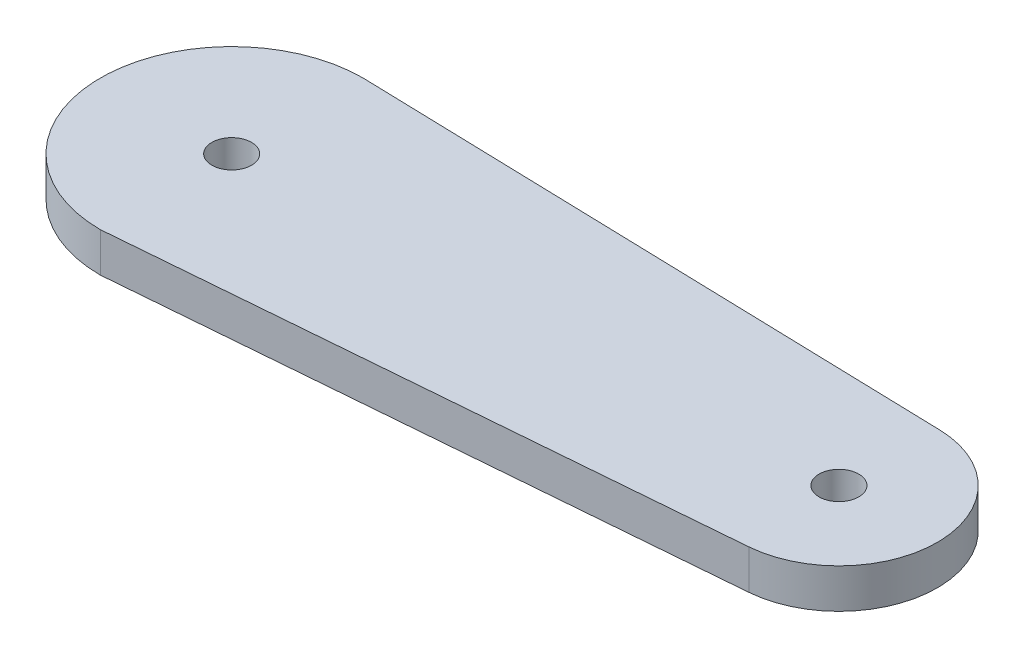
ISO-10303-21;
HEADER;
FILE_DESCRIPTION(('STEP AP214'),'2;1');
FILE_NAME('part.step','',(''),(''),'','','');
FILE_SCHEMA(('AUTOMOTIVE_DESIGN { 1 0 10303 214 1 1 1 1 }'));
ENDSEC;
DATA;
#1=APPLICATION_CONTEXT('core data for automotive mechanical design processes');
#2=APPLICATION_PROTOCOL_DEFINITION('international standard','automotive_design',2000,#1);
#3=PRODUCT_CONTEXT('',#1,'mechanical');
#4=PRODUCT('Part','Part','',(#3));
#5=PRODUCT_RELATED_PRODUCT_CATEGORY('part','',(#4));
#6=PRODUCT_DEFINITION_FORMATION('','',#4);
#7=PRODUCT_DEFINITION_CONTEXT('part definition',#1,'design');
#8=PRODUCT_DEFINITION('design','',#6,#7);
#9=PRODUCT_DEFINITION_SHAPE('','',#8);
#10=(LENGTH_UNIT() NAMED_UNIT(*) SI_UNIT(.MILLI.,.METRE.));
#11=(NAMED_UNIT(*) PLANE_ANGLE_UNIT() SI_UNIT($,.RADIAN.));
#12=(NAMED_UNIT(*) SI_UNIT($,.STERADIAN.) SOLID_ANGLE_UNIT());
#13=UNCERTAINTY_MEASURE_WITH_UNIT(LENGTH_MEASURE(1.E-05),#10,'distance_accuracy_value','');
#14=(GEOMETRIC_REPRESENTATION_CONTEXT(3) GLOBAL_UNCERTAINTY_ASSIGNED_CONTEXT((#13)) GLOBAL_UNIT_ASSIGNED_CONTEXT((#10,
#11,#12)) REPRESENTATION_CONTEXT('',''));
#15=CARTESIAN_POINT('',(0.,0.,0.));
#16=DIRECTION('',(0.,0.,1.));
#17=DIRECTION('',(1.,0.,0.));
#18=AXIS2_PLACEMENT_3D('',#15,#16,#17);
#19=CARTESIAN_POINT('',(0.821566681352623,3.,9.93204097591365));
#20=DIRECTION('',(-0.0824372634712927,0.,-0.996596256059275));
#21=DIRECTION('',(-0.996596256059275,0.,0.0824372634712927));
#22=AXIS2_PLACEMENT_3D('',#19,#20,#21);
#23=PLANE('',#22);
#24=DIRECTION('',(0.996596256059275,0.,-0.0824372634712927));
#25=VECTOR('',#24,1.);
#26=CARTESIAN_POINT('',(0.821566681352623,0.,9.93204097591365));
#27=LINE('',#26,#25);
#28=CARTESIAN_POINT('',(0.,0.,10.));
#29=VERTEX_POINT('',#28);
#30=CARTESIAN_POINT('',(45.6010112062696,0.,6.22793829245028));
#31=VERTEX_POINT('',#30);
#32=EDGE_CURVE('E97',#29,#31,#27,.T.);
#33=ORIENTED_EDGE('',*,*,#32,.T.);
#34=DIRECTION('',(0.,-1.,0.));
#35=VECTOR('',#34,1.);
#36=CARTESIAN_POINT('',(45.6010112062696,3.,6.22793829245028));
#37=LINE('',#36,#35);
#38=CARTESIAN_POINT('',(45.6010112062696,3.,6.22793829245028));
#39=VERTEX_POINT('',#38);
#40=EDGE_CURVE('E11',#39,#31,#37,.T.);
#41=ORIENTED_EDGE('',*,*,#40,.F.);
#42=DIRECTION('',(0.996596256059275,0.,-0.0824372634712927));
#43=VECTOR('',#42,1.);
#44=CARTESIAN_POINT('',(0.821566681352623,3.,9.93204097591365));
#45=LINE('',#44,#43);
#46=CARTESIAN_POINT('',(0.,3.,10.));
#47=VERTEX_POINT('',#46);
#48=EDGE_CURVE('E82',#47,#39,#45,.T.);
#49=ORIENTED_EDGE('',*,*,#48,.F.);
#50=DIRECTION('',(0.,-1.,0.));
#51=VECTOR('',#50,1.);
#52=CARTESIAN_POINT('',(0.,3.,10.));
#53=LINE('',#52,#51);
#54=EDGE_CURVE('E93',#47,#29,#53,.T.);
#55=ORIENTED_EDGE('',*,*,#54,.T.);
#56=EDGE_LOOP('',(#33,#41,#49,#55));
#57=FACE_BOUND('',#56,.T.);
#58=ADVANCED_FACE('F35',(#57),#23,.F.);
#59=CARTESIAN_POINT('',(44.9827317302349,3.,-1.24653362799429));
#60=DIRECTION('',(0.,-1.,0.));
#61=DIRECTION('',(0.,0.,-1.));
#62=AXIS2_PLACEMENT_3D('',#59,#60,#61);
#63=CYLINDRICAL_SURFACE('',#62,7.50000000000001);
#64=CARTESIAN_POINT('',(44.9827317302349,0.,-1.24653362799429));
#65=DIRECTION('',(0.,1.,0.));
#66=DIRECTION('',(0.,0.,1.));
#67=AXIS2_PLACEMENT_3D('',#64,#65,#66);
#68=CIRCLE('',#67,7.50000000000001);
#69=CARTESIAN_POINT('',(45.1911593044558,0.,-8.74363693169128));
#70=VERTEX_POINT('',#69);
#71=EDGE_CURVE('E87',#31,#70,#68,.T.);
#72=ORIENTED_EDGE('',*,*,#71,.T.);
#73=DIRECTION('',(0.,-1.,0.));
#74=VECTOR('',#73,1.);
#75=CARTESIAN_POINT('',(45.1911593044558,3.,-8.74363693169128));
#76=LINE('',#75,#74);
#77=CARTESIAN_POINT('',(45.1911593044558,3.,-8.74363693169128));
#78=VERTEX_POINT('',#77);
#79=EDGE_CURVE('E43',#78,#70,#76,.T.);
#80=ORIENTED_EDGE('',*,*,#79,.F.);
#81=CARTESIAN_POINT('',(44.9827317302349,3.,-1.24653362799429));
#82=DIRECTION('',(0.,1.,0.));
#83=DIRECTION('',(0.,0.,1.));
#84=AXIS2_PLACEMENT_3D('',#81,#82,#83);
#85=CIRCLE('',#84,7.50000000000001);
#86=EDGE_CURVE('E77',#39,#78,#85,.T.);
#87=ORIENTED_EDGE('',*,*,#86,.F.);
#88=ORIENTED_EDGE('',*,*,#40,.T.);
#89=EDGE_LOOP('',(#72,#80,#87,#88));
#90=FACE_BOUND('',#89,.T.);
#91=ADVANCED_FACE('F86',(#90),#63,.T.);
#92=CARTESIAN_POINT('',(0.277796098715276,3.,-9.99227696823189));
#93=DIRECTION('',(0.0277903432294599,0.,-0.999613773826266));
#94=DIRECTION('',(-0.999613773826266,0.,-0.0277903432294599));
#95=AXIS2_PLACEMENT_3D('',#92,#93,#94);
#96=PLANE('',#95);
#97=DIRECTION('',(0.999613773826266,0.,0.0277903432294599));
#98=VECTOR('',#97,1.);
#99=CARTESIAN_POINT('',(0.277796098715276,0.,-9.99227696823189));
#100=LINE('',#99,#98);
#101=CARTESIAN_POINT('',(0.,0.,-10.));
#102=VERTEX_POINT('',#101);
#103=EDGE_CURVE('E102',#102,#70,#100,.T.);
#104=ORIENTED_EDGE('',*,*,#103,.F.);
#105=DIRECTION('',(0.,-1.,0.));
#106=VECTOR('',#105,1.);
#107=CARTESIAN_POINT('',(0.,3.,-10.));
#108=LINE('',#107,#106);
#109=CARTESIAN_POINT('',(0.,3.,-10.));
#110=VERTEX_POINT('',#109);
#111=EDGE_CURVE('E67',#110,#102,#108,.T.);
#112=ORIENTED_EDGE('',*,*,#111,.F.);
#113=DIRECTION('',(0.999613773826266,0.,0.0277903432294599));
#114=VECTOR('',#113,1.);
#115=CARTESIAN_POINT('',(0.277796098715276,3.,-9.99227696823189));
#116=LINE('',#115,#114);
#117=EDGE_CURVE('E80',#110,#78,#116,.T.);
#118=ORIENTED_EDGE('',*,*,#117,.T.);
#119=ORIENTED_EDGE('',*,*,#79,.T.);
#120=EDGE_LOOP('',(#104,#112,#118,#119));
#121=FACE_BOUND('',#120,.T.);
#122=ADVANCED_FACE('F91',(#121),#96,.T.);
#123=CARTESIAN_POINT('',(0.,3.,0.));
#124=DIRECTION('',(0.,-1.,0.));
#125=DIRECTION('',(0.,0.,-1.));
#126=AXIS2_PLACEMENT_3D('',#123,#124,#125);
#127=CYLINDRICAL_SURFACE('',#126,10.);
#128=CARTESIAN_POINT('',(0.,0.,0.));
#129=DIRECTION('',(0.,1.,0.));
#130=DIRECTION('',(0.,0.,1.));
#131=AXIS2_PLACEMENT_3D('',#128,#129,#130);
#132=CIRCLE('',#131,10.);
#133=EDGE_CURVE('E70',#102,#29,#132,.T.);
#134=ORIENTED_EDGE('',*,*,#133,.T.);
#135=ORIENTED_EDGE('',*,*,#54,.F.);
#136=CARTESIAN_POINT('',(0.,3.,0.));
#137=DIRECTION('',(0.,1.,0.));
#138=DIRECTION('',(0.,0.,1.));
#139=AXIS2_PLACEMENT_3D('',#136,#137,#138);
#140=CIRCLE('',#139,10.);
#141=EDGE_CURVE('E51',#110,#47,#140,.T.);
#142=ORIENTED_EDGE('',*,*,#141,.F.);
#143=ORIENTED_EDGE('',*,*,#111,.T.);
#144=EDGE_LOOP('',(#134,#135,#142,#143));
#145=FACE_BOUND('',#144,.T.);
#146=ADVANCED_FACE('F121',(#145),#127,.T.);
#147=CARTESIAN_POINT('',(0.,3.,0.));
#148=DIRECTION('',(0.,1.,0.));
#149=DIRECTION('',(0.,0.,1.));
#150=AXIS2_PLACEMENT_3D('',#147,#148,#149);
#151=PLANE('',#150);
#152=CARTESIAN_POINT('',(0.,3.,0.));
#153=DIRECTION('',(0.,1.,0.));
#154=DIRECTION('',(0.,0.,1.));
#155=AXIS2_PLACEMENT_3D('',#152,#153,#154);
#156=CIRCLE('',#155,1.51);
#157=CARTESIAN_POINT('',(0.,3.,1.51));
#158=VERTEX_POINT('',#157);
#159=EDGE_CURVE('E173',#158,#158,#156,.T.);
#160=ORIENTED_EDGE('',*,*,#159,.F.);
#161=EDGE_LOOP('',(#160));
#162=FACE_BOUND('',#161,.T.);
#163=CARTESIAN_POINT('',(44.9827317302349,3.,-1.24653362799429));
#164=DIRECTION('',(0.,1.,0.));
#165=DIRECTION('',(0.,0.,1.));
#166=AXIS2_PLACEMENT_3D('',#163,#164,#165);
#167=CIRCLE('',#166,1.51);
#168=CARTESIAN_POINT('',(44.9827317302349,3.,0.263466372005712));
#169=VERTEX_POINT('',#168);
#170=EDGE_CURVE('E179',#169,#169,#167,.T.);
#171=ORIENTED_EDGE('',*,*,#170,.F.);
#172=EDGE_LOOP('',(#171));
#173=FACE_BOUND('',#172,.T.);
#174=ORIENTED_EDGE('',*,*,#48,.T.);
#175=ORIENTED_EDGE('',*,*,#86,.T.);
#176=ORIENTED_EDGE('',*,*,#117,.F.);
#177=ORIENTED_EDGE('',*,*,#141,.T.);
#178=EDGE_LOOP('',(#174,#175,#176,#177));
#179=FACE_BOUND('',#178,.T.);
#180=ADVANCED_FACE('F78',(#162,#173,#179),#151,.T.);
#181=CARTESIAN_POINT('',(0.,0.,0.));
#182=DIRECTION('',(0.,1.,0.));
#183=DIRECTION('',(0.,0.,1.));
#184=AXIS2_PLACEMENT_3D('',#181,#182,#183);
#185=PLANE('',#184);
#186=CARTESIAN_POINT('',(0.,0.,0.));
#187=DIRECTION('',(0.,1.,0.));
#188=DIRECTION('',(0.,0.,1.));
#189=AXIS2_PLACEMENT_3D('',#186,#187,#188);
#190=CIRCLE('',#189,1.51);
#191=CARTESIAN_POINT('',(0.,0.,1.51));
#192=VERTEX_POINT('',#191);
#193=EDGE_CURVE('E100',#192,#192,#190,.F.);
#194=ORIENTED_EDGE('',*,*,#193,.F.);
#195=EDGE_LOOP('',(#194));
#196=FACE_BOUND('',#195,.T.);
#197=CARTESIAN_POINT('',(44.9827317302349,0.,-1.24653362799429));
#198=DIRECTION('',(0.,1.,0.));
#199=DIRECTION('',(0.,0.,1.));
#200=AXIS2_PLACEMENT_3D('',#197,#198,#199);
#201=CIRCLE('',#200,1.51);
#202=CARTESIAN_POINT('',(44.9827317302349,0.,0.263466372005712));
#203=VERTEX_POINT('',#202);
#204=EDGE_CURVE('E176',#203,#203,#201,.F.);
#205=ORIENTED_EDGE('',*,*,#204,.F.);
#206=EDGE_LOOP('',(#205));
#207=FACE_BOUND('',#206,.T.);
#208=ORIENTED_EDGE('',*,*,#32,.F.);
#209=ORIENTED_EDGE('',*,*,#133,.F.);
#210=ORIENTED_EDGE('',*,*,#103,.T.);
#211=ORIENTED_EDGE('',*,*,#71,.F.);
#212=EDGE_LOOP('',(#208,#209,#210,#211));
#213=FACE_BOUND('',#212,.T.);
#214=ADVANCED_FACE('F109',(#196,#207,#213),#185,.F.);
#215=CARTESIAN_POINT('',(44.9827317302349,-0.00100000000000013,-1.24653362799429));
#216=DIRECTION('',(0.,1.,0.));
#217=DIRECTION('',(0.,0.,1.));
#218=AXIS2_PLACEMENT_3D('',#215,#216,#217);
#219=CYLINDRICAL_SURFACE('',#218,1.51);
#220=CARTESIAN_POINT('',(44.9827317302349,3.,0.263466372005712));
#221=CARTESIAN_POINT('',(44.9827317302349,2.96875,0.263466372005712));
#222=CARTESIAN_POINT('',(44.9827317302349,2.9375,0.263466372005712));
#223=CARTESIAN_POINT('',(44.9827317302349,2.875,0.263466372005712));
#224=CARTESIAN_POINT('',(44.9827317302349,2.84375,0.263466372005712));
#225=CARTESIAN_POINT('',(44.9827317302349,2.78125,0.263466372005712));
#226=CARTESIAN_POINT('',(44.9827317302349,2.75,0.263466372005712));
#227=CARTESIAN_POINT('',(44.9827317302349,2.6875,0.263466372005712));
#228=CARTESIAN_POINT('',(44.9827317302349,2.65625,0.263466372005712));
#229=CARTESIAN_POINT('',(44.9827317302349,2.59375,0.263466372005712));
#230=CARTESIAN_POINT('',(44.9827317302349,2.5625,0.263466372005712));
#231=CARTESIAN_POINT('',(44.9827317302349,2.5,0.263466372005712));
#232=CARTESIAN_POINT('',(44.9827317302349,2.46875,0.263466372005712));
#233=CARTESIAN_POINT('',(44.9827317302349,2.40625,0.263466372005712));
#234=CARTESIAN_POINT('',(44.9827317302349,2.375,0.263466372005712));
#235=CARTESIAN_POINT('',(44.9827317302349,2.3125,0.263466372005712));
#236=CARTESIAN_POINT('',(44.9827317302349,2.28125,0.263466372005712));
#237=CARTESIAN_POINT('',(44.9827317302349,2.21875,0.263466372005712));
#238=CARTESIAN_POINT('',(44.9827317302349,2.1875,0.263466372005712));
#239=CARTESIAN_POINT('',(44.9827317302349,2.125,0.263466372005712));
#240=CARTESIAN_POINT('',(44.9827317302349,2.09375,0.263466372005712));
#241=CARTESIAN_POINT('',(44.9827317302349,2.03125,0.263466372005712));
#242=CARTESIAN_POINT('',(44.9827317302349,2.,0.263466372005712));
#243=CARTESIAN_POINT('',(44.9827317302349,1.9375,0.263466372005712));
#244=CARTESIAN_POINT('',(44.9827317302349,1.90625,0.263466372005712));
#245=CARTESIAN_POINT('',(44.9827317302349,1.84375,0.263466372005712));
#246=CARTESIAN_POINT('',(44.9827317302349,1.8125,0.263466372005712));
#247=CARTESIAN_POINT('',(44.9827317302349,1.75,0.263466372005712));
#248=CARTESIAN_POINT('',(44.9827317302349,1.71875,0.263466372005712));
#249=CARTESIAN_POINT('',(44.9827317302349,1.65625,0.263466372005712));
#250=CARTESIAN_POINT('',(44.9827317302349,1.625,0.263466372005712));
#251=CARTESIAN_POINT('',(44.9827317302349,1.5625,0.263466372005712));
#252=CARTESIAN_POINT('',(44.9827317302349,1.53125,0.263466372005712));
#253=CARTESIAN_POINT('',(44.9827317302349,1.46875,0.263466372005712));
#254=CARTESIAN_POINT('',(44.9827317302349,1.4375,0.263466372005712));
#255=CARTESIAN_POINT('',(44.9827317302349,1.375,0.263466372005712));
#256=CARTESIAN_POINT('',(44.9827317302349,1.34375,0.263466372005712));
#257=CARTESIAN_POINT('',(44.9827317302349,1.28125,0.263466372005712));
#258=CARTESIAN_POINT('',(44.9827317302349,1.25,0.263466372005712));
#259=CARTESIAN_POINT('',(44.9827317302349,1.1875,0.263466372005712));
#260=CARTESIAN_POINT('',(44.9827317302349,1.15625,0.263466372005712));
#261=CARTESIAN_POINT('',(44.9827317302349,1.09375,0.263466372005712));
#262=CARTESIAN_POINT('',(44.9827317302349,1.0625,0.263466372005712));
#263=CARTESIAN_POINT('',(44.9827317302349,1.,0.263466372005712));
#264=CARTESIAN_POINT('',(44.9827317302349,0.96875,0.263466372005712));
#265=CARTESIAN_POINT('',(44.9827317302349,0.90625,0.263466372005712));
#266=CARTESIAN_POINT('',(44.9827317302349,0.875,0.263466372005712));
#267=CARTESIAN_POINT('',(44.9827317302349,0.8125,0.263466372005712));
#268=CARTESIAN_POINT('',(44.9827317302349,0.78125,0.263466372005712));
#269=CARTESIAN_POINT('',(44.9827317302349,0.71875,0.263466372005712));
#270=CARTESIAN_POINT('',(44.9827317302349,0.6875,0.263466372005712));
#271=CARTESIAN_POINT('',(44.9827317302349,0.625,0.263466372005712));
#272=CARTESIAN_POINT('',(44.9827317302349,0.59375,0.263466372005712));
#273=CARTESIAN_POINT('',(44.9827317302349,0.53125,0.263466372005712));
#274=CARTESIAN_POINT('',(44.9827317302349,0.5,0.263466372005712));
#275=CARTESIAN_POINT('',(44.9827317302349,0.4375,0.263466372005712));
#276=CARTESIAN_POINT('',(44.9827317302349,0.40625,0.263466372005712));
#277=CARTESIAN_POINT('',(44.9827317302349,0.34375,0.263466372005712));
#278=CARTESIAN_POINT('',(44.9827317302349,0.3125,0.263466372005712));
#279=CARTESIAN_POINT('',(44.9827317302349,0.25,0.263466372005712));
#280=CARTESIAN_POINT('',(44.9827317302349,0.21875,0.263466372005712));
#281=CARTESIAN_POINT('',(44.9827317302349,0.15625,0.263466372005712));
#282=CARTESIAN_POINT('',(44.9827317302349,0.125,0.263466372005712));
#283=CARTESIAN_POINT('',(44.9827317302349,0.0625000000000001,0.263466372005712));
#284=CARTESIAN_POINT('',(44.9827317302349,0.0312500000000001,0.263466372005712));
#285=CARTESIAN_POINT('',(44.9827317302349,0.,0.263466372005712));
#286=B_SPLINE_CURVE_WITH_KNOTS('',3,(#220,#221,#222,#223,#224,#225,#226,#227,#228,#229,#230,
#231,#232,#233,#234,#235,#236,#237,#238,#239,#240,#241,#242,#243,#244,#245,#246,#247,#248,#249,
#250,#251,#252,#253,#254,#255,#256,#257,#258,#259,#260,#261,#262,#263,#264,#265,#266,#267,#268,
#269,#270,#271,#272,#273,#274,#275,#276,#277,#278,#279,#280,#281,#282,#283,#284,#285),
.UNSPECIFIED.,.F.,.F.,(4,2,2,2,2,2,2,2,2,2,2,2,2,2,2,2,2,2,2,2,2,2,2,2,2,2,2,2,2,2,2,2,4),(0.,
0.0937500000000001,0.1875,0.28125,0.375,0.46875,0.5625,0.65625,0.75,0.84375,0.9375,1.03125,
1.125,1.21875,1.3125,1.40625,1.5,1.59375,1.6875,1.78125,1.875,1.96875,2.0625,2.15625,2.25,
2.34375,2.4375,2.53125,2.625,2.71875,2.8125,2.90625,3.),.UNSPECIFIED.);
#287=EDGE_CURVE('BSEAM111',#169,#203,#286,.T.);
#288=ORIENTED_EDGE('',*,*,#170,.T.);
#289=ORIENTED_EDGE('',*,*,#204,.T.);
#290=ORIENTED_EDGE('',*,*,#287,.T.);
#291=ORIENTED_EDGE('',*,*,#287,.F.);
#292=EDGE_LOOP('',(#288,#290,#289,#291));
#293=FACE_BOUND('',#292,.T.);
#294=ADVANCED_FACE('F111',(#293),#219,.F.);
#295=CARTESIAN_POINT('',(0.,-0.00100000000000013,0.));
#296=DIRECTION('',(0.,1.,0.));
#297=DIRECTION('',(0.,0.,1.));
#298=AXIS2_PLACEMENT_3D('',#295,#296,#297);
#299=CYLINDRICAL_SURFACE('',#298,1.51);
#300=CARTESIAN_POINT('',(0.,3.,1.51));
#301=CARTESIAN_POINT('',(0.,2.96875,1.51));
#302=CARTESIAN_POINT('',(0.,2.9375,1.51));
#303=CARTESIAN_POINT('',(0.,2.875,1.51));
#304=CARTESIAN_POINT('',(0.,2.84375,1.51));
#305=CARTESIAN_POINT('',(0.,2.78125,1.51));
#306=CARTESIAN_POINT('',(0.,2.75,1.51));
#307=CARTESIAN_POINT('',(0.,2.6875,1.51));
#308=CARTESIAN_POINT('',(0.,2.65625,1.51));
#309=CARTESIAN_POINT('',(0.,2.59375,1.51));
#310=CARTESIAN_POINT('',(0.,2.5625,1.51));
#311=CARTESIAN_POINT('',(0.,2.5,1.51));
#312=CARTESIAN_POINT('',(0.,2.46875,1.51));
#313=CARTESIAN_POINT('',(0.,2.40625,1.51));
#314=CARTESIAN_POINT('',(0.,2.375,1.51));
#315=CARTESIAN_POINT('',(0.,2.3125,1.51));
#316=CARTESIAN_POINT('',(0.,2.28125,1.51));
#317=CARTESIAN_POINT('',(0.,2.21875,1.51));
#318=CARTESIAN_POINT('',(0.,2.1875,1.51));
#319=CARTESIAN_POINT('',(0.,2.125,1.51));
#320=CARTESIAN_POINT('',(0.,2.09375,1.51));
#321=CARTESIAN_POINT('',(0.,2.03125,1.51));
#322=CARTESIAN_POINT('',(0.,2.,1.51));
#323=CARTESIAN_POINT('',(0.,1.9375,1.51));
#324=CARTESIAN_POINT('',(0.,1.90625,1.51));
#325=CARTESIAN_POINT('',(0.,1.84375,1.51));
#326=CARTESIAN_POINT('',(0.,1.8125,1.51));
#327=CARTESIAN_POINT('',(0.,1.75,1.51));
#328=CARTESIAN_POINT('',(0.,1.71875,1.51));
#329=CARTESIAN_POINT('',(0.,1.65625,1.51));
#330=CARTESIAN_POINT('',(0.,1.625,1.51));
#331=CARTESIAN_POINT('',(0.,1.5625,1.51));
#332=CARTESIAN_POINT('',(0.,1.53125,1.51));
#333=CARTESIAN_POINT('',(0.,1.46875,1.51));
#334=CARTESIAN_POINT('',(0.,1.4375,1.51));
#335=CARTESIAN_POINT('',(0.,1.375,1.51));
#336=CARTESIAN_POINT('',(0.,1.34375,1.51));
#337=CARTESIAN_POINT('',(0.,1.28125,1.51));
#338=CARTESIAN_POINT('',(0.,1.25,1.51));
#339=CARTESIAN_POINT('',(0.,1.1875,1.51));
#340=CARTESIAN_POINT('',(0.,1.15625,1.51));
#341=CARTESIAN_POINT('',(0.,1.09375,1.51));
#342=CARTESIAN_POINT('',(0.,1.0625,1.51));
#343=CARTESIAN_POINT('',(0.,1.,1.51));
#344=CARTESIAN_POINT('',(0.,0.96875,1.51));
#345=CARTESIAN_POINT('',(0.,0.90625,1.51));
#346=CARTESIAN_POINT('',(0.,0.875,1.51));
#347=CARTESIAN_POINT('',(0.,0.8125,1.51));
#348=CARTESIAN_POINT('',(0.,0.78125,1.51));
#349=CARTESIAN_POINT('',(0.,0.71875,1.51));
#350=CARTESIAN_POINT('',(0.,0.6875,1.51));
#351=CARTESIAN_POINT('',(0.,0.625,1.51));
#352=CARTESIAN_POINT('',(0.,0.59375,1.51));
#353=CARTESIAN_POINT('',(0.,0.53125,1.51));
#354=CARTESIAN_POINT('',(0.,0.5,1.51));
#355=CARTESIAN_POINT('',(0.,0.4375,1.51));
#356=CARTESIAN_POINT('',(0.,0.40625,1.51));
#357=CARTESIAN_POINT('',(0.,0.34375,1.51));
#358=CARTESIAN_POINT('',(0.,0.3125,1.51));
#359=CARTESIAN_POINT('',(0.,0.25,1.51));
#360=CARTESIAN_POINT('',(0.,0.21875,1.51));
#361=CARTESIAN_POINT('',(0.,0.15625,1.51));
#362=CARTESIAN_POINT('',(0.,0.125,1.51));
#363=CARTESIAN_POINT('',(0.,0.0625000000000001,1.51));
#364=CARTESIAN_POINT('',(0.,0.0312500000000001,1.51));
#365=CARTESIAN_POINT('',(0.,0.,1.51));
#366=B_SPLINE_CURVE_WITH_KNOTS('',3,(#300,#301,#302,#303,#304,#305,#306,#307,#308,#309,#310,
#311,#312,#313,#314,#315,#316,#317,#318,#319,#320,#321,#322,#323,#324,#325,#326,#327,#328,#329,
#330,#331,#332,#333,#334,#335,#336,#337,#338,#339,#340,#341,#342,#343,#344,#345,#346,#347,#348,
#349,#350,#351,#352,#353,#354,#355,#356,#357,#358,#359,#360,#361,#362,#363,#364,#365),
.UNSPECIFIED.,.F.,.F.,(4,2,2,2,2,2,2,2,2,2,2,2,2,2,2,2,2,2,2,2,2,2,2,2,2,2,2,2,2,2,2,2,4),(0.,
0.0937500000000001,0.1875,0.28125,0.375,0.46875,0.5625,0.65625,0.75,0.84375,0.9375,1.03125,
1.125,1.21875,1.3125,1.40625,1.5,1.59375,1.6875,1.78125,1.875,1.96875,2.0625,2.15625,2.25,
2.34375,2.4375,2.53125,2.625,2.71875,2.8125,2.90625,3.),.UNSPECIFIED.);
#367=EDGE_CURVE('BSEAM118',#158,#192,#366,.T.);
#368=ORIENTED_EDGE('',*,*,#159,.T.);
#369=ORIENTED_EDGE('',*,*,#193,.T.);
#370=ORIENTED_EDGE('',*,*,#367,.T.);
#371=ORIENTED_EDGE('',*,*,#367,.F.);
#372=EDGE_LOOP('',(#368,#370,#369,#371));
#373=FACE_BOUND('',#372,.T.);
#374=ADVANCED_FACE('F118',(#373),#299,.F.);
#375=CLOSED_SHELL('',(#58,#91,#122,#146,#180,#214,#294,#374));
#376=MANIFOLD_SOLID_BREP('B2',#375);
#377=ADVANCED_BREP_SHAPE_REPRESENTATION('',(#18,#376),#14);
#378=SHAPE_DEFINITION_REPRESENTATION(#9,#377);
ENDSEC;
END-ISO-10303-21;
